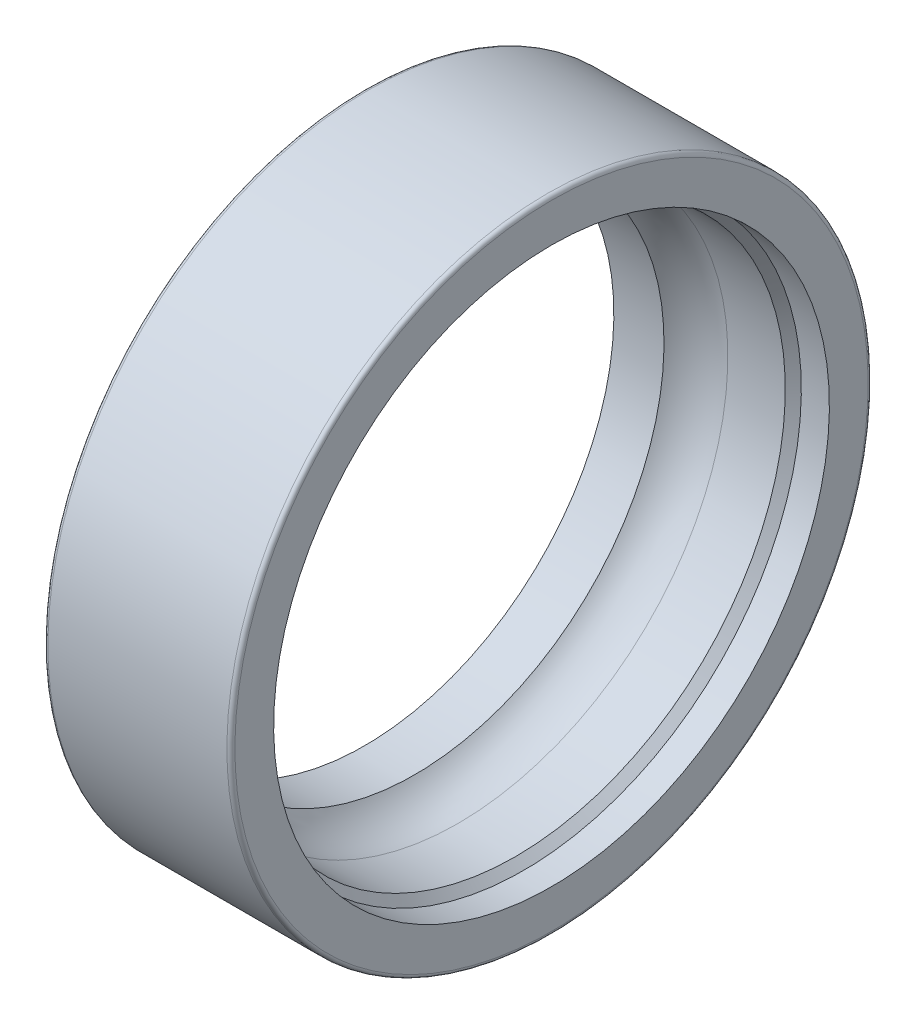
ISO-10303-21;
HEADER;
FILE_DESCRIPTION(('STEP AP214'),'2;1');
FILE_NAME('part.step','',(''),(''),'','','');
FILE_SCHEMA(('AUTOMOTIVE_DESIGN { 1 0 10303 214 1 1 1 1 }'));
ENDSEC;
DATA;
#1=APPLICATION_CONTEXT('core data for automotive mechanical design processes');
#2=APPLICATION_PROTOCOL_DEFINITION('international standard','automotive_design',2000,#1);
#3=PRODUCT_CONTEXT('',#1,'mechanical');
#4=PRODUCT('Part','Part','',(#3));
#5=PRODUCT_RELATED_PRODUCT_CATEGORY('part','',(#4));
#6=PRODUCT_DEFINITION_FORMATION('','',#4);
#7=PRODUCT_DEFINITION_CONTEXT('part definition',#1,'design');
#8=PRODUCT_DEFINITION('design','',#6,#7);
#9=PRODUCT_DEFINITION_SHAPE('','',#8);
#10=(LENGTH_UNIT() NAMED_UNIT(*) SI_UNIT(.MILLI.,.METRE.));
#11=(NAMED_UNIT(*) PLANE_ANGLE_UNIT() SI_UNIT($,.RADIAN.));
#12=(NAMED_UNIT(*) SI_UNIT($,.STERADIAN.) SOLID_ANGLE_UNIT());
#13=UNCERTAINTY_MEASURE_WITH_UNIT(LENGTH_MEASURE(1.E-05),#10,'distance_accuracy_value','');
#14=(GEOMETRIC_REPRESENTATION_CONTEXT(3) GLOBAL_UNCERTAINTY_ASSIGNED_CONTEXT((#13)) GLOBAL_UNIT_ASSIGNED_CONTEXT((#10,
#11,#12)) REPRESENTATION_CONTEXT('',''));
#15=CARTESIAN_POINT('',(0.,0.,0.));
#16=DIRECTION('',(0.,0.,1.));
#17=DIRECTION('',(1.,0.,0.));
#18=AXIS2_PLACEMENT_3D('',#15,#16,#17);
#19=CARTESIAN_POINT('',(3.35,0.,0.));
#20=DIRECTION('',(1.,0.,0.));
#21=DIRECTION('',(0.,0.,-1.));
#22=AXIS2_PLACEMENT_3D('',#19,#20,#21);
#23=TOROIDAL_SURFACE('',#22,11.85,0.15);
#24=CARTESIAN_POINT('',(3.35,0.,0.));
#25=DIRECTION('',(1.,0.,0.));
#26=DIRECTION('',(0.,1.,0.));
#27=AXIS2_PLACEMENT_3D('',#24,#25,#26);
#28=CIRCLE('',#27,12.);
#29=CARTESIAN_POINT('',(3.35,12.,0.));
#30=VERTEX_POINT('',#29);
#31=EDGE_CURVE('E11',#30,#30,#28,.T.);
#32=ORIENTED_EDGE('',*,*,#31,.T.);
#33=EDGE_LOOP('',(#32));
#34=FACE_BOUND('',#33,.T.);
#35=CARTESIAN_POINT('',(3.5,0.,0.));
#36=DIRECTION('',(1.,0.,0.));
#37=DIRECTION('',(0.,1.,0.));
#38=AXIS2_PLACEMENT_3D('',#35,#36,#37);
#39=CIRCLE('',#38,11.85);
#40=CARTESIAN_POINT('',(3.5,11.85,0.));
#41=VERTEX_POINT('',#40);
#42=EDGE_CURVE('E63',#41,#41,#39,.T.);
#43=ORIENTED_EDGE('',*,*,#42,.F.);
#44=EDGE_LOOP('',(#43));
#45=FACE_BOUND('',#44,.T.);
#46=ADVANCED_FACE('F16',(#34,#45),#23,.T.);
#47=CARTESIAN_POINT('',(0.,0.,0.));
#48=DIRECTION('',(-1.,0.,0.));
#49=DIRECTION('',(0.,1.,0.));
#50=AXIS2_PLACEMENT_3D('',#47,#48,#49);
#51=CYLINDRICAL_SURFACE('',#50,12.);
#52=CARTESIAN_POINT('',(-3.35,0.,0.));
#53=DIRECTION('',(1.,0.,0.));
#54=DIRECTION('',(0.,1.,0.));
#55=AXIS2_PLACEMENT_3D('',#52,#53,#54);
#56=CIRCLE('',#55,12.);
#57=CARTESIAN_POINT('',(-3.35,12.,0.));
#58=VERTEX_POINT('',#57);
#59=EDGE_CURVE('E25',#58,#58,#56,.T.);
#60=ORIENTED_EDGE('',*,*,#59,.T.);
#61=EDGE_LOOP('',(#60));
#62=FACE_BOUND('',#61,.T.);
#63=ORIENTED_EDGE('',*,*,#31,.F.);
#64=EDGE_LOOP('',(#63));
#65=FACE_BOUND('',#64,.T.);
#66=ADVANCED_FACE('F104',(#62,#65),#51,.T.);
#67=CARTESIAN_POINT('',(-3.35,0.,0.));
#68=DIRECTION('',(1.,0.,0.));
#69=DIRECTION('',(0.,0.,-1.));
#70=AXIS2_PLACEMENT_3D('',#67,#68,#69);
#71=TOROIDAL_SURFACE('',#70,11.85,0.15);
#72=CARTESIAN_POINT('',(-3.5,0.,0.));
#73=DIRECTION('',(1.,0.,0.));
#74=DIRECTION('',(0.,1.,0.));
#75=AXIS2_PLACEMENT_3D('',#72,#73,#74);
#76=CIRCLE('',#75,11.85);
#77=CARTESIAN_POINT('',(-3.5,11.85,0.));
#78=VERTEX_POINT('',#77);
#79=EDGE_CURVE('E80',#78,#78,#76,.T.);
#80=ORIENTED_EDGE('',*,*,#79,.T.);
#81=EDGE_LOOP('',(#80));
#82=FACE_BOUND('',#81,.T.);
#83=ORIENTED_EDGE('',*,*,#59,.F.);
#84=EDGE_LOOP('',(#83));
#85=FACE_BOUND('',#84,.T.);
#86=ADVANCED_FACE('F100',(#82,#85),#71,.T.);
#87=CARTESIAN_POINT('',(-3.5,10.5916666666667,0.));
#88=DIRECTION('',(-1.,0.,0.));
#89=DIRECTION('',(0.,-1.,0.));
#90=AXIS2_PLACEMENT_3D('',#87,#88,#89);
#91=PLANE('',#90);
#92=CARTESIAN_POINT('',(-3.5,0.,0.));
#93=DIRECTION('',(1.,0.,0.));
#94=DIRECTION('',(0.,1.,0.));
#95=AXIS2_PLACEMENT_3D('',#92,#93,#94);
#96=CIRCLE('',#95,9.33333333333334);
#97=CARTESIAN_POINT('',(-3.5,9.33333333333334,0.));
#98=VERTEX_POINT('',#97);
#99=EDGE_CURVE('E20',#98,#98,#96,.T.);
#100=ORIENTED_EDGE('',*,*,#99,.T.);
#101=EDGE_LOOP('',(#100));
#102=FACE_BOUND('',#101,.T.);
#103=ORIENTED_EDGE('',*,*,#79,.F.);
#104=EDGE_LOOP('',(#103));
#105=FACE_BOUND('',#104,.T.);
#106=ADVANCED_FACE('F86',(#102,#105),#91,.T.);
#107=CARTESIAN_POINT('',(-2.5612062349092,0.,0.));
#108=DIRECTION('',(-1.,0.,0.));
#109=DIRECTION('',(0.,1.,0.));
#110=AXIS2_PLACEMENT_3D('',#107,#108,#109);
#111=CYLINDRICAL_SURFACE('',#110,9.33333333333334);
#112=CARTESIAN_POINT('',(-1.6224124698184,0.,0.));
#113=DIRECTION('',(1.,0.,0.));
#114=DIRECTION('',(0.,1.,0.));
#115=AXIS2_PLACEMENT_3D('',#112,#113,#114);
#116=CIRCLE('',#115,9.33333333333334);
#117=CARTESIAN_POINT('',(-1.6224124698184,9.33333333333334,0.));
#118=VERTEX_POINT('',#117);
#119=EDGE_CURVE('E49',#118,#118,#116,.T.);
#120=ORIENTED_EDGE('',*,*,#119,.T.);
#121=EDGE_LOOP('',(#120));
#122=FACE_BOUND('',#121,.T.);
#123=ORIENTED_EDGE('',*,*,#99,.F.);
#124=EDGE_LOOP('',(#123));
#125=FACE_BOUND('',#124,.T.);
#126=ADVANCED_FACE('F89',(#122,#125),#111,.F.);
#127=CARTESIAN_POINT('',(0.,0.,0.));
#128=DIRECTION('',(1.,0.,0.));
#129=DIRECTION('',(0.,0.,-1.));
#130=AXIS2_PLACEMENT_3D('',#127,#128,#129);
#131=TOROIDAL_SURFACE('',#130,8.,2.1);
#132=CARTESIAN_POINT('',(0.,0.,0.));
#133=DIRECTION('',(1.,0.,0.));
#134=DIRECTION('',(0.,1.,0.));
#135=AXIS2_PLACEMENT_3D('',#132,#133,#134);
#136=CIRCLE('',#135,10.1);
#137=CARTESIAN_POINT('',(0.,10.1,0.));
#138=VERTEX_POINT('',#137);
#139=EDGE_CURVE('E56',#138,#138,#136,.T.);
#140=ORIENTED_EDGE('',*,*,#139,.T.);
#141=EDGE_LOOP('',(#140));
#142=FACE_BOUND('',#141,.T.);
#143=ORIENTED_EDGE('',*,*,#119,.F.);
#144=EDGE_LOOP('',(#143));
#145=FACE_BOUND('',#144,.T.);
#146=ADVANCED_FACE('F91',(#142,#145),#131,.F.);
#147=CARTESIAN_POINT('',(1.075,0.,0.));
#148=DIRECTION('',(-1.,0.,0.));
#149=DIRECTION('',(0.,1.,0.));
#150=AXIS2_PLACEMENT_3D('',#147,#148,#149);
#151=CYLINDRICAL_SURFACE('',#150,10.1);
#152=CARTESIAN_POINT('',(2.15,0.,0.));
#153=DIRECTION('',(1.,0.,0.));
#154=DIRECTION('',(0.,1.,0.));
#155=AXIS2_PLACEMENT_3D('',#152,#153,#154);
#156=CIRCLE('',#155,10.1);
#157=CARTESIAN_POINT('',(2.15,10.1,0.));
#158=VERTEX_POINT('',#157);
#159=EDGE_CURVE('E77',#158,#158,#156,.T.);
#160=ORIENTED_EDGE('',*,*,#159,.T.);
#161=EDGE_LOOP('',(#160));
#162=FACE_BOUND('',#161,.T.);
#163=ORIENTED_EDGE('',*,*,#139,.F.);
#164=EDGE_LOOP('',(#163));
#165=FACE_BOUND('',#164,.T.);
#166=ADVANCED_FACE('F98',(#162,#165),#151,.F.);
#167=CARTESIAN_POINT('',(2.3,0.,0.));
#168=DIRECTION('',(1.,0.,0.));
#169=DIRECTION('',(0.,1.,0.));
#170=AXIS2_PLACEMENT_3D('',#167,#168,#169);
#171=CONICAL_SURFACE('',#170,10.25,0.785398163397448);
#172=CARTESIAN_POINT('',(2.45,0.,0.));
#173=DIRECTION('',(1.,0.,0.));
#174=DIRECTION('',(0.,1.,0.));
#175=AXIS2_PLACEMENT_3D('',#172,#173,#174);
#176=CIRCLE('',#175,10.4);
#177=CARTESIAN_POINT('',(2.45,10.4,0.));
#178=VERTEX_POINT('',#177);
#179=EDGE_CURVE('E73',#178,#178,#176,.T.);
#180=ORIENTED_EDGE('',*,*,#179,.T.);
#181=EDGE_LOOP('',(#180));
#182=FACE_BOUND('',#181,.T.);
#183=ORIENTED_EDGE('',*,*,#159,.F.);
#184=EDGE_LOOP('',(#183));
#185=FACE_BOUND('',#184,.T.);
#186=ADVANCED_FACE('F18',(#182,#185),#171,.F.);
#187=CARTESIAN_POINT('',(2.975,0.,0.));
#188=DIRECTION('',(-1.,0.,0.));
#189=DIRECTION('',(0.,1.,0.));
#190=AXIS2_PLACEMENT_3D('',#187,#188,#189);
#191=CYLINDRICAL_SURFACE('',#190,10.4);
#192=CARTESIAN_POINT('',(3.5,0.,0.));
#193=DIRECTION('',(1.,0.,0.));
#194=DIRECTION('',(0.,1.,0.));
#195=AXIS2_PLACEMENT_3D('',#192,#193,#194);
#196=CIRCLE('',#195,10.4);
#197=CARTESIAN_POINT('',(3.5,10.4,0.));
#198=VERTEX_POINT('',#197);
#199=EDGE_CURVE('E68',#198,#198,#196,.T.);
#200=ORIENTED_EDGE('',*,*,#199,.T.);
#201=EDGE_LOOP('',(#200));
#202=FACE_BOUND('',#201,.T.);
#203=ORIENTED_EDGE('',*,*,#179,.F.);
#204=EDGE_LOOP('',(#203));
#205=FACE_BOUND('',#204,.T.);
#206=ADVANCED_FACE('F69',(#202,#205),#191,.F.);
#207=CARTESIAN_POINT('',(3.5,11.125,0.));
#208=DIRECTION('',(1.,0.,0.));
#209=DIRECTION('',(0.,1.,0.));
#210=AXIS2_PLACEMENT_3D('',#207,#208,#209);
#211=PLANE('',#210);
#212=ORIENTED_EDGE('',*,*,#42,.T.);
#213=EDGE_LOOP('',(#212));
#214=FACE_BOUND('',#213,.T.);
#215=ORIENTED_EDGE('',*,*,#199,.F.);
#216=EDGE_LOOP('',(#215));
#217=FACE_BOUND('',#216,.T.);
#218=ADVANCED_FACE('F113',(#214,#217),#211,.T.);
#219=CLOSED_SHELL('',(#46,#66,#86,#106,#126,#146,#166,#186,#206,#218));
#220=MANIFOLD_SOLID_BREP('B1',#219);
#221=ADVANCED_BREP_SHAPE_REPRESENTATION('',(#18,#220),#14);
#222=SHAPE_DEFINITION_REPRESENTATION(#9,#221);
ENDSEC;
END-ISO-10303-21;
